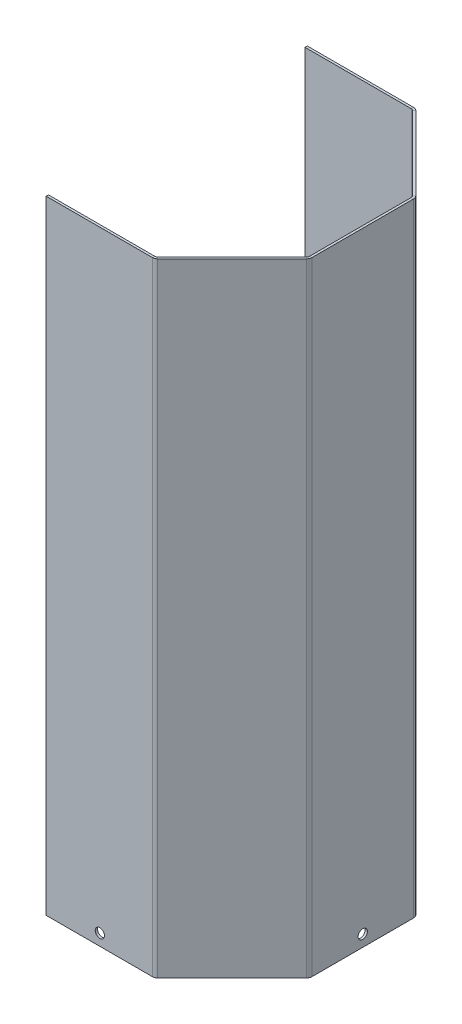
ISO-10303-21;
HEADER;
FILE_DESCRIPTION(('STEP AP214'),'2;1');
FILE_NAME('part.step','',(''),(''),'','','');
FILE_SCHEMA(('AUTOMOTIVE_DESIGN { 1 0 10303 214 1 1 1 1 }'));
ENDSEC;
DATA;
#1=APPLICATION_CONTEXT('core data for automotive mechanical design processes');
#2=APPLICATION_PROTOCOL_DEFINITION('international standard','automotive_design',2000,#1);
#3=PRODUCT_CONTEXT('',#1,'mechanical');
#4=PRODUCT('Part','Part','',(#3));
#5=PRODUCT_RELATED_PRODUCT_CATEGORY('part','',(#4));
#6=PRODUCT_DEFINITION_FORMATION('','',#4);
#7=PRODUCT_DEFINITION_CONTEXT('part definition',#1,'design');
#8=PRODUCT_DEFINITION('design','',#6,#7);
#9=PRODUCT_DEFINITION_SHAPE('','',#8);
#10=(LENGTH_UNIT() NAMED_UNIT(*) SI_UNIT(.MILLI.,.METRE.));
#11=(NAMED_UNIT(*) PLANE_ANGLE_UNIT() SI_UNIT($,.RADIAN.));
#12=(NAMED_UNIT(*) SI_UNIT($,.STERADIAN.) SOLID_ANGLE_UNIT());
#13=UNCERTAINTY_MEASURE_WITH_UNIT(LENGTH_MEASURE(1.E-05),#10,'distance_accuracy_value','');
#14=(GEOMETRIC_REPRESENTATION_CONTEXT(3) GLOBAL_UNCERTAINTY_ASSIGNED_CONTEXT((#13)) GLOBAL_UNIT_ASSIGNED_CONTEXT((#10,
#11,#12)) REPRESENTATION_CONTEXT('',''));
#15=CARTESIAN_POINT('',(0.,0.,0.));
#16=DIRECTION('',(0.,0.,1.));
#17=DIRECTION('',(1.,0.,0.));
#18=AXIS2_PLACEMENT_3D('',#15,#16,#17);
#19=CARTESIAN_POINT('',(43.7119337702441,270.,-55.7556349186104));
#20=DIRECTION('',(0.,1.,0.));
#21=DIRECTION('',(0.,0.,1.));
#22=AXIS2_PLACEMENT_3D('',#19,#20,#21);
#23=PLANE('',#22);
#24=DIRECTION('',(-0.707106781186547,0.,0.707106781186547));
#25=VECTOR('',#24,1.);
#26=CARTESIAN_POINT('',(43.7119337702441,270.,-55.7556349186104));
#27=LINE('',#26,#25);
#28=CARTESIAN_POINT('',(43.7119337702441,270.,-55.7556349186104));
#29=VERTEX_POINT('',#28);
#30=CARTESIAN_POINT('',(43.0048269890576,270.,-55.0485281374238));
#31=VERTEX_POINT('',#30);
#32=EDGE_CURVE('E11',#29,#31,#27,.T.);
#33=ORIENTED_EDGE('',*,*,#32,.F.);
#34=CARTESIAN_POINT('',(42.1562988516337,270.,-54.2));
#35=DIRECTION('',(0.,1.,0.));
#36=DIRECTION('',(0.,0.,1.));
#37=AXIS2_PLACEMENT_3D('',#34,#35,#36);
#38=CIRCLE('',#37,2.2);
#39=CARTESIAN_POINT('',(42.1562988516337,270.,-56.4));
#40=VERTEX_POINT('',#39);
#41=EDGE_CURVE('E388',#40,#29,#38,.F.);
#42=ORIENTED_EDGE('',*,*,#41,.F.);
#43=DIRECTION('',(0.,0.,-1.));
#44=VECTOR('',#43,1.);
#45=CARTESIAN_POINT('',(42.1562988516337,270.,-55.4));
#46=LINE('',#45,#44);
#47=CARTESIAN_POINT('',(42.1562988516337,270.,-55.4));
#48=VERTEX_POINT('',#47);
#49=EDGE_CURVE('E43',#48,#40,#46,.T.);
#50=ORIENTED_EDGE('',*,*,#49,.F.);
#51=CARTESIAN_POINT('',(42.1562988516337,270.,-54.2));
#52=DIRECTION('',(0.,1.,0.));
#53=DIRECTION('',(1.,0.,0.));
#54=AXIS2_PLACEMENT_3D('',#51,#52,#53);
#55=CIRCLE('',#54,1.2);
#56=EDGE_CURVE('E400',#48,#31,#55,.F.);
#57=ORIENTED_EDGE('',*,*,#56,.T.);
#58=EDGE_LOOP('',(#33,#42,#50,#57));
#59=FACE_BOUND('',#58,.T.);
#60=ADVANCED_FACE('F34',(#59),#23,.T.);
#61=CARTESIAN_POINT('',(42.1562988516337,270.,-55.4));
#62=DIRECTION('',(0.,1.,0.));
#63=DIRECTION('',(0.,0.,1.));
#64=AXIS2_PLACEMENT_3D('',#61,#62,#63);
#65=PLANE('',#64);
#66=DIRECTION('',(0.707106781186547,0.,0.707106781186548));
#67=VECTOR('',#66,1.);
#68=CARTESIAN_POINT('',(43.0675686888545,270.,-56.4));
#69=LINE('',#68,#67);
#70=CARTESIAN_POINT('',(75.8343508957581,270.,-23.6332177930964));
#71=VERTEX_POINT('',#70);
#72=EDGE_CURVE('E385',#29,#71,#69,.T.);
#73=ORIENTED_EDGE('',*,*,#72,.F.);
#74=ORIENTED_EDGE('',*,*,#32,.T.);
#75=DIRECTION('',(0.707106781186547,0.,0.707106781186548));
#76=VECTOR('',#75,1.);
#77=CARTESIAN_POINT('',(42.360461907668,270.,-55.6928932188134));
#78=LINE('',#77,#76);
#79=CARTESIAN_POINT('',(75.1272441145716,270.,-22.9261110119098));
#80=VERTEX_POINT('',#79);
#81=EDGE_CURVE('E403',#31,#80,#78,.T.);
#82=ORIENTED_EDGE('',*,*,#81,.T.);
#83=DIRECTION('',(0.707106781186551,0.,-0.707106781186544));
#84=VECTOR('',#83,1.);
#85=CARTESIAN_POINT('',(75.1272441145716,270.,-22.9261110119098));
#86=LINE('',#85,#84);
#87=EDGE_CURVE('E340',#80,#71,#86,.T.);
#88=ORIENTED_EDGE('',*,*,#87,.T.);
#89=EDGE_LOOP('',(#73,#74,#82,#88));
#90=FACE_BOUND('',#89,.T.);
#91=ADVANCED_FACE('F459',(#90),#65,.T.);
#92=CARTESIAN_POINT('',(42.1562988516337,0.,-56.4));
#93=DIRECTION('',(0.,-1.,0.));
#94=DIRECTION('',(0.,0.,-1.));
#95=AXIS2_PLACEMENT_3D('',#92,#93,#94);
#96=PLANE('',#95);
#97=DIRECTION('',(0.,0.,1.));
#98=VECTOR('',#97,1.);
#99=CARTESIAN_POINT('',(42.1562988516337,0.,-56.4));
#100=LINE('',#99,#98);
#101=CARTESIAN_POINT('',(42.1562988516337,0.,-56.4));
#102=VERTEX_POINT('',#101);
#103=CARTESIAN_POINT('',(42.1562988516337,0.,-55.4));
#104=VERTEX_POINT('',#103);
#105=EDGE_CURVE('E346',#102,#104,#100,.T.);
#106=ORIENTED_EDGE('',*,*,#105,.F.);
#107=CARTESIAN_POINT('',(42.1562988516337,0.,-54.2));
#108=DIRECTION('',(0.,1.,0.));
#109=DIRECTION('',(0.,0.,1.));
#110=AXIS2_PLACEMENT_3D('',#107,#108,#109);
#111=CIRCLE('',#110,2.2);
#112=CARTESIAN_POINT('',(43.7119337702441,0.,-55.7556349186104));
#113=VERTEX_POINT('',#112);
#114=EDGE_CURVE('E250',#102,#113,#111,.F.);
#115=ORIENTED_EDGE('',*,*,#114,.T.);
#116=DIRECTION('',(0.707106781186547,0.,-0.707106781186547));
#117=VECTOR('',#116,1.);
#118=CARTESIAN_POINT('',(43.0048269890576,0.,-55.0485281374238));
#119=LINE('',#118,#117);
#120=CARTESIAN_POINT('',(43.0048269890576,0.,-55.0485281374238));
#121=VERTEX_POINT('',#120);
#122=EDGE_CURVE('E344',#121,#113,#119,.T.);
#123=ORIENTED_EDGE('',*,*,#122,.F.);
#124=CARTESIAN_POINT('',(42.1562988516337,0.,-54.2));
#125=DIRECTION('',(0.,1.,0.));
#126=DIRECTION('',(1.,0.,0.));
#127=AXIS2_PLACEMENT_3D('',#124,#125,#126);
#128=CIRCLE('',#127,1.2);
#129=EDGE_CURVE('E262',#104,#121,#128,.F.);
#130=ORIENTED_EDGE('',*,*,#129,.F.);
#131=EDGE_LOOP('',(#106,#115,#123,#130));
#132=FACE_BOUND('',#131,.T.);
#133=ADVANCED_FACE('F464',(#132),#96,.T.);
#134=CARTESIAN_POINT('',(43.0048269890576,0.,-55.0485281374238));
#135=DIRECTION('',(0.,-1.,0.));
#136=DIRECTION('',(0.,0.,-1.));
#137=AXIS2_PLACEMENT_3D('',#134,#135,#136);
#138=PLANE('',#137);
#139=DIRECTION('',(1.,0.,0.));
#140=VECTOR('',#139,1.);
#141=CARTESIAN_POINT('',(-3.93243131114546,0.,-56.4));
#142=LINE('',#141,#140);
#143=CARTESIAN_POINT('',(-3.93243131114546,0.,-56.4));
#144=VERTEX_POINT('',#143);
#145=EDGE_CURVE('E253',#144,#102,#142,.T.);
#146=ORIENTED_EDGE('',*,*,#145,.T.);
#147=ORIENTED_EDGE('',*,*,#105,.T.);
#148=DIRECTION('',(1.,0.,0.));
#149=VECTOR('',#148,1.);
#150=CARTESIAN_POINT('',(-3.93243131114546,0.,-55.4));
#151=LINE('',#150,#149);
#152=CARTESIAN_POINT('',(-3.93243131114546,0.,-55.4));
#153=VERTEX_POINT('',#152);
#154=EDGE_CURVE('E259',#153,#104,#151,.T.);
#155=ORIENTED_EDGE('',*,*,#154,.F.);
#156=DIRECTION('',(0.,0.,-1.));
#157=VECTOR('',#156,1.);
#158=CARTESIAN_POINT('',(-3.93243131114546,0.,-55.4));
#159=LINE('',#158,#157);
#160=EDGE_CURVE('E256',#153,#144,#159,.T.);
#161=ORIENTED_EDGE('',*,*,#160,.T.);
#162=EDGE_LOOP('',(#146,#147,#155,#161));
#163=FACE_BOUND('',#162,.T.);
#164=ADVANCED_FACE('F520',(#163),#138,.T.);
#165=CARTESIAN_POINT('',(76.4787159771477,270.,-22.077582874486));
#166=DIRECTION('',(0.,1.,0.));
#167=DIRECTION('',(0.,0.,1.));
#168=AXIS2_PLACEMENT_3D('',#165,#166,#167);
#169=PLANE('',#168);
#170=DIRECTION('',(-1.,0.,0.));
#171=VECTOR('',#170,1.);
#172=CARTESIAN_POINT('',(76.4787159771477,270.,-22.077582874486));
#173=LINE('',#172,#171);
#174=CARTESIAN_POINT('',(76.4787159771477,270.,-22.077582874486));
#175=VERTEX_POINT('',#174);
#176=CARTESIAN_POINT('',(75.4787159771477,270.,-22.077582874486));
#177=VERTEX_POINT('',#176);
#178=EDGE_CURVE('E342',#175,#177,#173,.T.);
#179=ORIENTED_EDGE('',*,*,#178,.F.);
#180=CARTESIAN_POINT('',(74.2787159771477,270.,-22.077582874486));
#181=DIRECTION('',(0.,1.,0.));
#182=DIRECTION('',(0.,0.,1.));
#183=AXIS2_PLACEMENT_3D('',#180,#181,#182);
#184=CIRCLE('',#183,2.2);
#185=EDGE_CURVE('E382',#71,#175,#184,.F.);
#186=ORIENTED_EDGE('',*,*,#185,.F.);
#187=ORIENTED_EDGE('',*,*,#87,.F.);
#188=CARTESIAN_POINT('',(74.2787159771477,270.,-22.077582874486));
#189=DIRECTION('',(0.,1.,0.));
#190=DIRECTION('',(1.,0.,0.));
#191=AXIS2_PLACEMENT_3D('',#188,#189,#190);
#192=CIRCLE('',#191,1.2);
#193=EDGE_CURVE('E406',#80,#177,#192,.F.);
#194=ORIENTED_EDGE('',*,*,#193,.T.);
#195=EDGE_LOOP('',(#179,#186,#187,#194));
#196=FACE_BOUND('',#195,.T.);
#197=ADVANCED_FACE('F508',(#196),#169,.T.);
#198=CARTESIAN_POINT('',(75.1272441145716,270.,-22.9261110119098));
#199=DIRECTION('',(0.,1.,0.));
#200=DIRECTION('',(0.,0.,1.));
#201=AXIS2_PLACEMENT_3D('',#198,#199,#200);
#202=PLANE('',#201);
#203=DIRECTION('',(0.,0.,1.));
#204=VECTOR('',#203,1.);
#205=CARTESIAN_POINT('',(76.4787159771477,270.,-22.9888527117068));
#206=LINE('',#205,#204);
#207=CARTESIAN_POINT('',(76.4787159771477,270.,22.077582874486));
#208=VERTEX_POINT('',#207);
#209=EDGE_CURVE('E379',#175,#208,#206,.T.);
#210=ORIENTED_EDGE('',*,*,#209,.F.);
#211=ORIENTED_EDGE('',*,*,#178,.T.);
#212=DIRECTION('',(0.,0.,1.));
#213=VECTOR('',#212,1.);
#214=CARTESIAN_POINT('',(75.4787159771477,270.,-22.9888527117068));
#215=LINE('',#214,#213);
#216=CARTESIAN_POINT('',(75.4787159771477,270.,22.077582874486));
#217=VERTEX_POINT('',#216);
#218=EDGE_CURVE('E203',#177,#217,#215,.T.);
#219=ORIENTED_EDGE('',*,*,#218,.T.);
#220=DIRECTION('',(1.,0.,0.));
#221=VECTOR('',#220,1.);
#222=CARTESIAN_POINT('',(75.4787159771477,270.,22.077582874486));
#223=LINE('',#222,#221);
#224=EDGE_CURVE('E194',#217,#208,#223,.T.);
#225=ORIENTED_EDGE('',*,*,#224,.T.);
#226=EDGE_LOOP('',(#210,#211,#219,#225));
#227=FACE_BOUND('',#226,.T.);
#228=ADVANCED_FACE('F412',(#227),#202,.T.);
#229=CARTESIAN_POINT('',(75.8343508957581,0.,-23.6332177930964));
#230=DIRECTION('',(0.,-1.,0.));
#231=DIRECTION('',(0.,0.,-1.));
#232=AXIS2_PLACEMENT_3D('',#229,#230,#231);
#233=PLANE('',#232);
#234=DIRECTION('',(-0.707106781186551,0.,0.707106781186544));
#235=VECTOR('',#234,1.);
#236=CARTESIAN_POINT('',(75.8343508957581,0.,-23.6332177930964));
#237=LINE('',#236,#235);
#238=CARTESIAN_POINT('',(75.8343508957581,0.,-23.6332177930964));
#239=VERTEX_POINT('',#238);
#240=CARTESIAN_POINT('',(75.1272441145716,0.,-22.9261110119098));
#241=VERTEX_POINT('',#240);
#242=EDGE_CURVE('E338',#239,#241,#237,.T.);
#243=ORIENTED_EDGE('',*,*,#242,.F.);
#244=CARTESIAN_POINT('',(74.2787159771477,0.,-22.077582874486));
#245=DIRECTION('',(0.,1.,0.));
#246=DIRECTION('',(0.,0.,1.));
#247=AXIS2_PLACEMENT_3D('',#244,#245,#246);
#248=CIRCLE('',#247,2.2);
#249=CARTESIAN_POINT('',(76.4787159771477,0.,-22.077582874486));
#250=VERTEX_POINT('',#249);
#251=EDGE_CURVE('E244',#239,#250,#248,.F.);
#252=ORIENTED_EDGE('',*,*,#251,.T.);
#253=DIRECTION('',(1.,0.,0.));
#254=VECTOR('',#253,1.);
#255=CARTESIAN_POINT('',(75.4787159771477,0.,-22.077582874486));
#256=LINE('',#255,#254);
#257=CARTESIAN_POINT('',(75.4787159771477,0.,-22.077582874486));
#258=VERTEX_POINT('',#257);
#259=EDGE_CURVE('E193',#258,#250,#256,.T.);
#260=ORIENTED_EDGE('',*,*,#259,.F.);
#261=CARTESIAN_POINT('',(74.2787159771477,0.,-22.077582874486));
#262=DIRECTION('',(0.,1.,0.));
#263=DIRECTION('',(1.,0.,0.));
#264=AXIS2_PLACEMENT_3D('',#261,#262,#263);
#265=CIRCLE('',#264,1.2);
#266=EDGE_CURVE('E268',#241,#258,#265,.F.);
#267=ORIENTED_EDGE('',*,*,#266,.F.);
#268=EDGE_LOOP('',(#243,#252,#260,#267));
#269=FACE_BOUND('',#268,.T.);
#270=ADVANCED_FACE('F532',(#269),#233,.T.);
#271=CARTESIAN_POINT('',(75.4787159771477,0.,-22.077582874486));
#272=DIRECTION('',(0.,-1.,0.));
#273=DIRECTION('',(0.,0.,-1.));
#274=AXIS2_PLACEMENT_3D('',#271,#272,#273);
#275=PLANE('',#274);
#276=DIRECTION('',(0.707106781186547,0.,0.707106781186548));
#277=VECTOR('',#276,1.);
#278=CARTESIAN_POINT('',(43.0675686888545,0.,-56.4));
#279=LINE('',#278,#277);
#280=EDGE_CURVE('E247',#113,#239,#279,.T.);
#281=ORIENTED_EDGE('',*,*,#280,.T.);
#282=ORIENTED_EDGE('',*,*,#242,.T.);
#283=DIRECTION('',(0.707106781186547,0.,0.707106781186548));
#284=VECTOR('',#283,1.);
#285=CARTESIAN_POINT('',(42.360461907668,0.,-55.6928932188134));
#286=LINE('',#285,#284);
#287=EDGE_CURVE('E265',#121,#241,#286,.T.);
#288=ORIENTED_EDGE('',*,*,#287,.F.);
#289=ORIENTED_EDGE('',*,*,#122,.T.);
#290=EDGE_LOOP('',(#281,#282,#288,#289));
#291=FACE_BOUND('',#290,.T.);
#292=ADVANCED_FACE('F517',(#291),#275,.T.);
#293=CARTESIAN_POINT('',(75.8343508957581,270.,23.6332177930964));
#294=DIRECTION('',(0.,1.,0.));
#295=DIRECTION('',(0.,0.,1.));
#296=AXIS2_PLACEMENT_3D('',#293,#294,#295);
#297=PLANE('',#296);
#298=DIRECTION('',(-0.707106781186546,0.,-0.707106781186549));
#299=VECTOR('',#298,1.);
#300=CARTESIAN_POINT('',(75.8343508957581,270.,23.6332177930964));
#301=LINE('',#300,#299);
#302=CARTESIAN_POINT('',(75.8343508957581,270.,23.6332177930964));
#303=VERTEX_POINT('',#302);
#304=CARTESIAN_POINT('',(75.1272441145716,270.,22.9261110119098));
#305=VERTEX_POINT('',#304);
#306=EDGE_CURVE('E181',#303,#305,#301,.T.);
#307=ORIENTED_EDGE('',*,*,#306,.F.);
#308=CARTESIAN_POINT('',(74.2787159771477,270.,22.077582874486));
#309=DIRECTION('',(0.,1.,0.));
#310=DIRECTION('',(0.,0.,1.));
#311=AXIS2_PLACEMENT_3D('',#308,#309,#310);
#312=CIRCLE('',#311,2.2);
#313=EDGE_CURVE('E377',#208,#303,#312,.F.);
#314=ORIENTED_EDGE('',*,*,#313,.F.);
#315=ORIENTED_EDGE('',*,*,#224,.F.);
#316=CARTESIAN_POINT('',(74.2787159771477,270.,22.077582874486));
#317=DIRECTION('',(0.,1.,0.));
#318=DIRECTION('',(1.,0.,0.));
#319=AXIS2_PLACEMENT_3D('',#316,#317,#318);
#320=CIRCLE('',#319,1.2);
#321=EDGE_CURVE('E197',#217,#305,#320,.F.);
#322=ORIENTED_EDGE('',*,*,#321,.T.);
#323=EDGE_LOOP('',(#307,#314,#315,#322));
#324=FACE_BOUND('',#323,.T.);
#325=ADVANCED_FACE('F199',(#324),#297,.T.);
#326=CARTESIAN_POINT('',(75.4787159771477,270.,22.077582874486));
#327=DIRECTION('',(0.,1.,0.));
#328=DIRECTION('',(0.,0.,1.));
#329=AXIS2_PLACEMENT_3D('',#326,#327,#328);
#330=PLANE('',#329);
#331=DIRECTION('',(-0.707106781186548,0.,0.707106781186548));
#332=VECTOR('',#331,1.);
#333=CARTESIAN_POINT('',(76.4787159771477,270.,22.9888527117068));
#334=LINE('',#333,#332);
#335=CARTESIAN_POINT('',(43.5119337702441,270.,55.9556349186104));
#336=VERTEX_POINT('',#335);
#337=EDGE_CURVE('E188',#303,#336,#334,.T.);
#338=ORIENTED_EDGE('',*,*,#337,.F.);
#339=ORIENTED_EDGE('',*,*,#306,.T.);
#340=DIRECTION('',(-0.707106781186548,0.,0.707106781186548));
#341=VECTOR('',#340,1.);
#342=CARTESIAN_POINT('',(75.7716091959612,270.,22.2817459305202));
#343=LINE('',#342,#341);
#344=CARTESIAN_POINT('',(42.8048269890575,270.,55.2485281374239));
#345=VERTEX_POINT('',#344);
#346=EDGE_CURVE('E185',#305,#345,#343,.T.);
#347=ORIENTED_EDGE('',*,*,#346,.T.);
#348=DIRECTION('',(0.707106781186544,0.,0.707106781186551));
#349=VECTOR('',#348,1.);
#350=CARTESIAN_POINT('',(42.8048269890575,270.,55.2485281374239));
#351=LINE('',#350,#349);
#352=EDGE_CURVE('E329',#345,#336,#351,.T.);
#353=ORIENTED_EDGE('',*,*,#352,.T.);
#354=EDGE_LOOP('',(#338,#339,#347,#353));
#355=FACE_BOUND('',#354,.T.);
#356=ADVANCED_FACE('F183',(#355),#330,.T.);
#357=CARTESIAN_POINT('',(76.4787159771477,0.,22.077582874486));
#358=DIRECTION('',(0.,-1.,0.));
#359=DIRECTION('',(0.,0.,-1.));
#360=AXIS2_PLACEMENT_3D('',#357,#358,#359);
#361=PLANE('',#360);
#362=DIRECTION('',(-1.,0.,0.));
#363=VECTOR('',#362,1.);
#364=CARTESIAN_POINT('',(76.4787159771477,0.,22.077582874486));
#365=LINE('',#364,#363);
#366=CARTESIAN_POINT('',(76.4787159771477,0.,22.077582874486));
#367=VERTEX_POINT('',#366);
#368=CARTESIAN_POINT('',(75.4787159771477,0.,22.077582874486));
#369=VERTEX_POINT('',#368);
#370=EDGE_CURVE('E334',#367,#369,#365,.T.);
#371=ORIENTED_EDGE('',*,*,#370,.F.);
#372=CARTESIAN_POINT('',(74.2787159771477,0.,22.077582874486));
#373=DIRECTION('',(0.,1.,0.));
#374=DIRECTION('',(0.,0.,1.));
#375=AXIS2_PLACEMENT_3D('',#372,#373,#374);
#376=CIRCLE('',#375,2.2);
#377=CARTESIAN_POINT('',(75.8343508957581,0.,23.6332177930964));
#378=VERTEX_POINT('',#377);
#379=EDGE_CURVE('E238',#367,#378,#376,.F.);
#380=ORIENTED_EDGE('',*,*,#379,.T.);
#381=DIRECTION('',(0.707106781186546,0.,0.707106781186549));
#382=VECTOR('',#381,1.);
#383=CARTESIAN_POINT('',(75.1272441145716,0.,22.9261110119098));
#384=LINE('',#383,#382);
#385=CARTESIAN_POINT('',(75.1272441145716,0.,22.9261110119098));
#386=VERTEX_POINT('',#385);
#387=EDGE_CURVE('E332',#386,#378,#384,.T.);
#388=ORIENTED_EDGE('',*,*,#387,.F.);
#389=CARTESIAN_POINT('',(74.2787159771477,0.,22.077582874486));
#390=DIRECTION('',(0.,1.,0.));
#391=DIRECTION('',(1.,0.,0.));
#392=AXIS2_PLACEMENT_3D('',#389,#390,#391);
#393=CIRCLE('',#392,1.2);
#394=EDGE_CURVE('E210',#369,#386,#393,.F.);
#395=ORIENTED_EDGE('',*,*,#394,.F.);
#396=EDGE_LOOP('',(#371,#380,#388,#395));
#397=FACE_BOUND('',#396,.T.);
#398=ADVANCED_FACE('F418',(#397),#361,.T.);
#399=CARTESIAN_POINT('',(75.1272441145716,0.,22.9261110119098));
#400=DIRECTION('',(0.,-1.,0.));
#401=DIRECTION('',(0.,0.,-1.));
#402=AXIS2_PLACEMENT_3D('',#399,#400,#401);
#403=PLANE('',#402);
#404=DIRECTION('',(0.,0.,1.));
#405=VECTOR('',#404,1.);
#406=CARTESIAN_POINT('',(76.4787159771477,0.,-22.9888527117068));
#407=LINE('',#406,#405);
#408=EDGE_CURVE('E241',#250,#367,#407,.T.);
#409=ORIENTED_EDGE('',*,*,#408,.T.);
#410=ORIENTED_EDGE('',*,*,#370,.T.);
#411=DIRECTION('',(0.,0.,1.));
#412=VECTOR('',#411,1.);
#413=CARTESIAN_POINT('',(75.4787159771477,0.,-22.9888527117068));
#414=LINE('',#413,#412);
#415=EDGE_CURVE('E271',#258,#369,#414,.T.);
#416=ORIENTED_EDGE('',*,*,#415,.F.);
#417=ORIENTED_EDGE('',*,*,#259,.T.);
#418=EDGE_LOOP('',(#409,#410,#416,#417));
#419=FACE_BOUND('',#418,.T.);
#420=ADVANCED_FACE('F543',(#419),#403,.T.);
#421=CARTESIAN_POINT('',(41.9562988516337,270.,56.6));
#422=DIRECTION('',(0.,1.,0.));
#423=DIRECTION('',(0.,0.,1.));
#424=AXIS2_PLACEMENT_3D('',#421,#422,#423);
#425=PLANE('',#424);
#426=DIRECTION('',(0.,0.,-1.));
#427=VECTOR('',#426,1.);
#428=CARTESIAN_POINT('',(41.9562988516337,270.,56.6));
#429=LINE('',#428,#427);
#430=CARTESIAN_POINT('',(41.9562988516337,270.,56.6));
#431=VERTEX_POINT('',#430);
#432=CARTESIAN_POINT('',(41.9562988516337,270.,55.6));
#433=VERTEX_POINT('',#432);
#434=EDGE_CURVE('E52',#431,#433,#429,.T.);
#435=ORIENTED_EDGE('',*,*,#434,.F.);
#436=CARTESIAN_POINT('',(41.9562988516337,270.,54.4));
#437=DIRECTION('',(0.,1.,0.));
#438=DIRECTION('',(0.,0.,1.));
#439=AXIS2_PLACEMENT_3D('',#436,#437,#438);
#440=CIRCLE('',#439,2.2);
#441=EDGE_CURVE('E373',#336,#431,#440,.F.);
#442=ORIENTED_EDGE('',*,*,#441,.F.);
#443=ORIENTED_EDGE('',*,*,#352,.F.);
#444=CARTESIAN_POINT('',(41.9562988516337,270.,54.4));
#445=DIRECTION('',(0.,1.,0.));
#446=DIRECTION('',(1.,0.,0.));
#447=AXIS2_PLACEMENT_3D('',#444,#445,#446);
#448=CIRCLE('',#447,1.2);
#449=EDGE_CURVE('E218',#345,#433,#448,.F.);
#450=ORIENTED_EDGE('',*,*,#449,.T.);
#451=EDGE_LOOP('',(#435,#442,#443,#450));
#452=FACE_BOUND('',#451,.T.);
#453=ADVANCED_FACE('F546',(#452),#425,.T.);
#454=CARTESIAN_POINT('',(42.8048269890575,270.,55.2485281374239));
#455=DIRECTION('',(0.,1.,0.));
#456=DIRECTION('',(0.,0.,1.));
#457=AXIS2_PLACEMENT_3D('',#454,#455,#456);
#458=PLANE('',#457);
#459=DIRECTION('',(-1.,0.,0.));
#460=VECTOR('',#459,1.);
#461=CARTESIAN_POINT('',(42.8675686888545,270.,56.6));
#462=LINE('',#461,#460);
#463=CARTESIAN_POINT('',(-4.1324313111455,270.,56.6));
#464=VERTEX_POINT('',#463);
#465=EDGE_CURVE('E370',#431,#464,#462,.T.);
#466=ORIENTED_EDGE('',*,*,#465,.F.);
#467=ORIENTED_EDGE('',*,*,#434,.T.);
#468=DIRECTION('',(1.,0.,0.));
#469=VECTOR('',#468,1.);
#470=CARTESIAN_POINT('',(42.8675686888545,270.,55.6));
#471=LINE('',#470,#469);
#472=CARTESIAN_POINT('',(-4.1324313111455,270.,55.6));
#473=VERTEX_POINT('',#472);
#474=EDGE_CURVE('E130',#433,#473,#471,.F.);
#475=ORIENTED_EDGE('',*,*,#474,.T.);
#476=DIRECTION('',(0.,0.,-1.));
#477=VECTOR('',#476,1.);
#478=CARTESIAN_POINT('',(-4.1324313111455,270.,56.6));
#479=LINE('',#478,#477);
#480=EDGE_CURVE('E367',#464,#473,#479,.T.);
#481=ORIENTED_EDGE('',*,*,#480,.F.);
#482=EDGE_LOOP('',(#466,#467,#475,#481));
#483=FACE_BOUND('',#482,.T.);
#484=ADVANCED_FACE('F445',(#483),#458,.T.);
#485=CARTESIAN_POINT('',(43.5119337702441,0.,55.9556349186104));
#486=DIRECTION('',(0.,-1.,0.));
#487=DIRECTION('',(0.,0.,-1.));
#488=AXIS2_PLACEMENT_3D('',#485,#486,#487);
#489=PLANE('',#488);
#490=DIRECTION('',(-0.707106781186544,0.,-0.707106781186551));
#491=VECTOR('',#490,1.);
#492=CARTESIAN_POINT('',(43.5119337702441,0.,55.9556349186104));
#493=LINE('',#492,#491);
#494=CARTESIAN_POINT('',(43.5119337702441,0.,55.9556349186104));
#495=VERTEX_POINT('',#494);
#496=CARTESIAN_POINT('',(42.8048269890575,0.,55.2485281374239));
#497=VERTEX_POINT('',#496);
#498=EDGE_CURVE('E117',#495,#497,#493,.T.);
#499=ORIENTED_EDGE('',*,*,#498,.F.);
#500=CARTESIAN_POINT('',(41.9562988516337,0.,54.4));
#501=DIRECTION('',(0.,1.,0.));
#502=DIRECTION('',(0.,0.,1.));
#503=AXIS2_PLACEMENT_3D('',#500,#501,#502);
#504=CIRCLE('',#503,2.2);
#505=CARTESIAN_POINT('',(41.9562988516337,0.,56.6));
#506=VERTEX_POINT('',#505);
#507=EDGE_CURVE('E234',#495,#506,#504,.F.);
#508=ORIENTED_EDGE('',*,*,#507,.T.);
#509=DIRECTION('',(0.,0.,1.));
#510=VECTOR('',#509,1.);
#511=CARTESIAN_POINT('',(41.9562988516337,0.,55.6));
#512=LINE('',#511,#510);
#513=CARTESIAN_POINT('',(41.9562988516337,0.,55.6));
#514=VERTEX_POINT('',#513);
#515=EDGE_CURVE('E124',#514,#506,#512,.T.);
#516=ORIENTED_EDGE('',*,*,#515,.F.);
#517=CARTESIAN_POINT('',(41.9562988516337,0.,54.4));
#518=DIRECTION('',(0.,1.,0.));
#519=DIRECTION('',(1.,0.,0.));
#520=AXIS2_PLACEMENT_3D('',#517,#518,#519);
#521=CIRCLE('',#520,1.2);
#522=EDGE_CURVE('E277',#497,#514,#521,.F.);
#523=ORIENTED_EDGE('',*,*,#522,.F.);
#524=EDGE_LOOP('',(#499,#508,#516,#523));
#525=FACE_BOUND('',#524,.T.);
#526=ADVANCED_FACE('F433',(#525),#489,.T.);
#527=CARTESIAN_POINT('',(41.9562988516337,0.,55.6));
#528=DIRECTION('',(0.,-1.,0.));
#529=DIRECTION('',(0.,0.,-1.));
#530=AXIS2_PLACEMENT_3D('',#527,#528,#529);
#531=PLANE('',#530);
#532=DIRECTION('',(-0.707106781186548,0.,0.707106781186548));
#533=VECTOR('',#532,1.);
#534=CARTESIAN_POINT('',(76.4787159771477,0.,22.9888527117068));
#535=LINE('',#534,#533);
#536=EDGE_CURVE('E236',#378,#495,#535,.T.);
#537=ORIENTED_EDGE('',*,*,#536,.T.);
#538=ORIENTED_EDGE('',*,*,#498,.T.);
#539=DIRECTION('',(-0.707106781186548,0.,0.707106781186548));
#540=VECTOR('',#539,1.);
#541=CARTESIAN_POINT('',(75.7716091959612,0.,22.2817459305202));
#542=LINE('',#541,#540);
#543=EDGE_CURVE('E275',#386,#497,#542,.T.);
#544=ORIENTED_EDGE('',*,*,#543,.F.);
#545=ORIENTED_EDGE('',*,*,#387,.T.);
#546=EDGE_LOOP('',(#537,#538,#544,#545));
#547=FACE_BOUND('',#546,.T.);
#548=ADVANCED_FACE('F420',(#547),#531,.T.);
#549=CARTESIAN_POINT('',(42.8675686888545,270.,55.6));
#550=DIRECTION('',(0.,0.,1.));
#551=DIRECTION('',(1.,0.,0.));
#552=AXIS2_PLACEMENT_3D('',#549,#550,#551);
#553=PLANE('',#552);
#554=CARTESIAN_POINT('',(19.1119337702441,5.,55.6));
#555=DIRECTION('',(0.,0.,1.));
#556=DIRECTION('',(1.,0.,0.));
#557=AXIS2_PLACEMENT_3D('',#554,#555,#556);
#558=CIRCLE('',#557,2.);
#559=CARTESIAN_POINT('',(21.1119337702441,5.,55.6));
#560=VERTEX_POINT('',#559);
#561=EDGE_CURVE('E228',#560,#560,#558,.T.);
#562=ORIENTED_EDGE('',*,*,#561,.T.);
#563=EDGE_LOOP('',(#562));
#564=FACE_BOUND('',#563,.T.);
#565=DIRECTION('',(1.,0.,0.));
#566=VECTOR('',#565,1.);
#567=CARTESIAN_POINT('',(42.8675686888545,0.,55.6));
#568=LINE('',#567,#566);
#569=CARTESIAN_POINT('',(-4.1324313111455,0.,55.6));
#570=VERTEX_POINT('',#569);
#571=EDGE_CURVE('E224',#514,#570,#568,.F.);
#572=ORIENTED_EDGE('',*,*,#571,.T.);
#573=DIRECTION('',(0.,-1.,0.));
#574=VECTOR('',#573,1.);
#575=CARTESIAN_POINT('',(-4.1324313111455,270.,55.6));
#576=LINE('',#575,#574);
#577=EDGE_CURVE('E325',#473,#570,#576,.T.);
#578=ORIENTED_EDGE('',*,*,#577,.F.);
#579=ORIENTED_EDGE('',*,*,#474,.F.);
#580=DIRECTION('',(0.,-1.,0.));
#581=VECTOR('',#580,1.);
#582=CARTESIAN_POINT('',(41.9562988516337,270.,55.6));
#583=LINE('',#582,#581);
#584=EDGE_CURVE('E220',#433,#514,#583,.T.);
#585=ORIENTED_EDGE('',*,*,#584,.T.);
#586=EDGE_LOOP('',(#572,#578,#579,#585));
#587=FACE_BOUND('',#586,.T.);
#588=ADVANCED_FACE('F439',(#564,#587),#553,.F.);
#589=CARTESIAN_POINT('',(-4.1324313111455,270.,56.6));
#590=DIRECTION('',(-1.,0.,0.));
#591=DIRECTION('',(0.,0.,1.));
#592=AXIS2_PLACEMENT_3D('',#589,#590,#591);
#593=PLANE('',#592);
#594=DIRECTION('',(0.,0.,-1.));
#595=VECTOR('',#594,1.);
#596=CARTESIAN_POINT('',(-4.1324313111455,0.,56.6));
#597=LINE('',#596,#595);
#598=CARTESIAN_POINT('',(-4.1324313111455,0.,56.6));
#599=VERTEX_POINT('',#598);
#600=EDGE_CURVE('E227',#599,#570,#597,.T.);
#601=ORIENTED_EDGE('',*,*,#600,.F.);
#602=DIRECTION('',(0.,-1.,0.));
#603=VECTOR('',#602,1.);
#604=CARTESIAN_POINT('',(-4.1324313111455,270.,56.6));
#605=LINE('',#604,#603);
#606=EDGE_CURVE('E323',#464,#599,#605,.T.);
#607=ORIENTED_EDGE('',*,*,#606,.F.);
#608=ORIENTED_EDGE('',*,*,#480,.T.);
#609=ORIENTED_EDGE('',*,*,#577,.T.);
#610=EDGE_LOOP('',(#601,#607,#608,#609));
#611=FACE_BOUND('',#610,.T.);
#612=ADVANCED_FACE('F444',(#611),#593,.T.);
#613=CARTESIAN_POINT('',(42.8675686888545,270.,56.6));
#614=DIRECTION('',(0.,0.,1.));
#615=DIRECTION('',(1.,0.,0.));
#616=AXIS2_PLACEMENT_3D('',#613,#614,#615);
#617=PLANE('',#616);
#618=CARTESIAN_POINT('',(19.1119337702441,5.,56.6));
#619=DIRECTION('',(0.,0.,1.));
#620=DIRECTION('',(1.,0.,0.));
#621=AXIS2_PLACEMENT_3D('',#618,#619,#620);
#622=CIRCLE('',#621,2.);
#623=CARTESIAN_POINT('',(21.1119337702441,5.,56.6));
#624=VERTEX_POINT('',#623);
#625=EDGE_CURVE('E350',#624,#624,#622,.T.);
#626=ORIENTED_EDGE('',*,*,#625,.F.);
#627=EDGE_LOOP('',(#626));
#628=FACE_BOUND('',#627,.T.);
#629=DIRECTION('',(-1.,0.,0.));
#630=VECTOR('',#629,1.);
#631=CARTESIAN_POINT('',(42.8675686888545,0.,56.6));
#632=LINE('',#631,#630);
#633=EDGE_CURVE('E231',#506,#599,#632,.T.);
#634=ORIENTED_EDGE('',*,*,#633,.F.);
#635=DIRECTION('',(0.,-1.,0.));
#636=VECTOR('',#635,1.);
#637=CARTESIAN_POINT('',(41.9562988516337,270.,56.6));
#638=LINE('',#637,#636);
#639=EDGE_CURVE('E320',#431,#506,#638,.T.);
#640=ORIENTED_EDGE('',*,*,#639,.F.);
#641=ORIENTED_EDGE('',*,*,#465,.T.);
#642=ORIENTED_EDGE('',*,*,#606,.T.);
#643=EDGE_LOOP('',(#634,#640,#641,#642));
#644=FACE_BOUND('',#643,.T.);
#645=ADVANCED_FACE('F447',(#628,#644),#617,.T.);
#646=CARTESIAN_POINT('',(41.9562988516337,270.,54.4));
#647=DIRECTION('',(0.,-1.,0.));
#648=DIRECTION('',(0.,0.,-1.));
#649=AXIS2_PLACEMENT_3D('',#646,#647,#648);
#650=CYLINDRICAL_SURFACE('',#649,2.2);
#651=ORIENTED_EDGE('',*,*,#507,.F.);
#652=DIRECTION('',(0.,-1.,0.));
#653=VECTOR('',#652,1.);
#654=CARTESIAN_POINT('',(43.5119337702441,270.,55.9556349186104));
#655=LINE('',#654,#653);
#656=EDGE_CURVE('E317',#336,#495,#655,.T.);
#657=ORIENTED_EDGE('',*,*,#656,.F.);
#658=ORIENTED_EDGE('',*,*,#441,.T.);
#659=ORIENTED_EDGE('',*,*,#639,.T.);
#660=EDGE_LOOP('',(#651,#657,#658,#659));
#661=FACE_BOUND('',#660,.T.);
#662=ADVANCED_FACE('F430',(#661),#650,.T.);
#663=CARTESIAN_POINT('',(76.4787159771477,270.,22.9888527117068));
#664=DIRECTION('',(0.707106781186547,0.,0.707106781186547));
#665=DIRECTION('',(0.707106781186548,0.,-0.707106781186548));
#666=AXIS2_PLACEMENT_3D('',#663,#664,#665);
#667=PLANE('',#666);
#668=ORIENTED_EDGE('',*,*,#536,.F.);
#669=DIRECTION('',(0.,-1.,0.));
#670=VECTOR('',#669,1.);
#671=CARTESIAN_POINT('',(75.8343508957581,270.,23.6332177930964));
#672=LINE('',#671,#670);
#673=EDGE_CURVE('E314',#303,#378,#672,.T.);
#674=ORIENTED_EDGE('',*,*,#673,.F.);
#675=ORIENTED_EDGE('',*,*,#337,.T.);
#676=ORIENTED_EDGE('',*,*,#656,.T.);
#677=EDGE_LOOP('',(#668,#674,#675,#676));
#678=FACE_BOUND('',#677,.T.);
#679=ADVANCED_FACE('F425',(#678),#667,.T.);
#680=CARTESIAN_POINT('',(74.2787159771477,270.,22.077582874486));
#681=DIRECTION('',(0.,-1.,0.));
#682=DIRECTION('',(0.,0.,-1.));
#683=AXIS2_PLACEMENT_3D('',#680,#681,#682);
#684=CYLINDRICAL_SURFACE('',#683,2.2);
#685=ORIENTED_EDGE('',*,*,#379,.F.);
#686=DIRECTION('',(0.,-1.,0.));
#687=VECTOR('',#686,1.);
#688=CARTESIAN_POINT('',(76.4787159771477,270.,22.077582874486));
#689=LINE('',#688,#687);
#690=EDGE_CURVE('E311',#208,#367,#689,.T.);
#691=ORIENTED_EDGE('',*,*,#690,.F.);
#692=ORIENTED_EDGE('',*,*,#313,.T.);
#693=ORIENTED_EDGE('',*,*,#673,.T.);
#694=EDGE_LOOP('',(#685,#691,#692,#693));
#695=FACE_BOUND('',#694,.T.);
#696=ADVANCED_FACE('F423',(#695),#684,.T.);
#697=CARTESIAN_POINT('',(76.4787159771477,270.,-22.9888527117068));
#698=DIRECTION('',(1.,0.,0.));
#699=DIRECTION('',(0.,0.,-1.));
#700=AXIS2_PLACEMENT_3D('',#697,#698,#699);
#701=PLANE('',#700);
#702=CARTESIAN_POINT('',(76.4787159771477,5.,0.));
#703=DIRECTION('',(1.,0.,0.));
#704=DIRECTION('',(0.,0.,-1.));
#705=AXIS2_PLACEMENT_3D('',#702,#703,#704);
#706=CIRCLE('',#705,2.);
#707=CARTESIAN_POINT('',(76.4787159771477,5.,-2.00000000000002));
#708=VERTEX_POINT('',#707);
#709=EDGE_CURVE('E361',#708,#708,#706,.T.);
#710=ORIENTED_EDGE('',*,*,#709,.F.);
#711=EDGE_LOOP('',(#710));
#712=FACE_BOUND('',#711,.T.);
#713=ORIENTED_EDGE('',*,*,#408,.F.);
#714=DIRECTION('',(0.,-1.,0.));
#715=VECTOR('',#714,1.);
#716=CARTESIAN_POINT('',(76.4787159771477,270.,-22.077582874486));
#717=LINE('',#716,#715);
#718=EDGE_CURVE('E308',#175,#250,#717,.T.);
#719=ORIENTED_EDGE('',*,*,#718,.F.);
#720=ORIENTED_EDGE('',*,*,#209,.T.);
#721=ORIENTED_EDGE('',*,*,#690,.T.);
#722=EDGE_LOOP('',(#713,#719,#720,#721));
#723=FACE_BOUND('',#722,.T.);
#724=ADVANCED_FACE('F608',(#712,#723),#701,.T.);
#725=CARTESIAN_POINT('',(74.2787159771477,270.,-22.077582874486));
#726=DIRECTION('',(0.,-1.,0.));
#727=DIRECTION('',(0.,0.,-1.));
#728=AXIS2_PLACEMENT_3D('',#725,#726,#727);
#729=CYLINDRICAL_SURFACE('',#728,2.2);
#730=ORIENTED_EDGE('',*,*,#251,.F.);
#731=DIRECTION('',(0.,-1.,0.));
#732=VECTOR('',#731,1.);
#733=CARTESIAN_POINT('',(75.8343508957581,270.,-23.6332177930964));
#734=LINE('',#733,#732);
#735=EDGE_CURVE('E305',#71,#239,#734,.T.);
#736=ORIENTED_EDGE('',*,*,#735,.F.);
#737=ORIENTED_EDGE('',*,*,#185,.T.);
#738=ORIENTED_EDGE('',*,*,#718,.T.);
#739=EDGE_LOOP('',(#730,#736,#737,#738));
#740=FACE_BOUND('',#739,.T.);
#741=ADVANCED_FACE('F513',(#740),#729,.T.);
#742=CARTESIAN_POINT('',(43.0675686888545,270.,-56.4));
#743=DIRECTION('',(0.707106781186548,0.,-0.707106781186547));
#744=DIRECTION('',(-0.707106781186547,0.,-0.707106781186548));
#745=AXIS2_PLACEMENT_3D('',#742,#743,#744);
#746=PLANE('',#745);
#747=ORIENTED_EDGE('',*,*,#280,.F.);
#748=DIRECTION('',(0.,-1.,0.));
#749=VECTOR('',#748,1.);
#750=CARTESIAN_POINT('',(43.7119337702441,270.,-55.7556349186104));
#751=LINE('',#750,#749);
#752=EDGE_CURVE('E302',#29,#113,#751,.T.);
#753=ORIENTED_EDGE('',*,*,#752,.F.);
#754=ORIENTED_EDGE('',*,*,#72,.T.);
#755=ORIENTED_EDGE('',*,*,#735,.T.);
#756=EDGE_LOOP('',(#747,#753,#754,#755));
#757=FACE_BOUND('',#756,.T.);
#758=ADVANCED_FACE('F473',(#757),#746,.T.);
#759=CARTESIAN_POINT('',(42.1562988516337,270.,-54.2));
#760=DIRECTION('',(0.,-1.,0.));
#761=DIRECTION('',(0.,0.,-1.));
#762=AXIS2_PLACEMENT_3D('',#759,#760,#761);
#763=CYLINDRICAL_SURFACE('',#762,2.2);
#764=ORIENTED_EDGE('',*,*,#114,.F.);
#765=DIRECTION('',(0.,-1.,0.));
#766=VECTOR('',#765,1.);
#767=CARTESIAN_POINT('',(42.1562988516337,270.,-56.4));
#768=LINE('',#767,#766);
#769=EDGE_CURVE('E299',#40,#102,#768,.T.);
#770=ORIENTED_EDGE('',*,*,#769,.F.);
#771=ORIENTED_EDGE('',*,*,#41,.T.);
#772=ORIENTED_EDGE('',*,*,#752,.T.);
#773=EDGE_LOOP('',(#764,#770,#771,#772));
#774=FACE_BOUND('',#773,.T.);
#775=ADVANCED_FACE('F478',(#774),#763,.T.);
#776=CARTESIAN_POINT('',(-3.93243131114546,270.,-56.4));
#777=DIRECTION('',(0.,0.,-1.));
#778=DIRECTION('',(-1.,0.,0.));
#779=AXIS2_PLACEMENT_3D('',#776,#777,#778);
#780=PLANE('',#779);
#781=CARTESIAN_POINT('',(19.1119337702441,5.,-56.4));
#782=DIRECTION('',(0.,0.,-1.));
#783=DIRECTION('',(-1.,0.,0.));
#784=AXIS2_PLACEMENT_3D('',#781,#782,#783);
#785=CIRCLE('',#784,2.);
#786=CARTESIAN_POINT('',(17.1119337702441,5.,-56.4));
#787=VERTEX_POINT('',#786);
#788=EDGE_CURVE('E351',#787,#787,#785,.T.);
#789=ORIENTED_EDGE('',*,*,#788,.F.);
#790=EDGE_LOOP('',(#789));
#791=FACE_BOUND('',#790,.T.);
#792=ORIENTED_EDGE('',*,*,#145,.F.);
#793=DIRECTION('',(0.,-1.,0.));
#794=VECTOR('',#793,1.);
#795=CARTESIAN_POINT('',(-3.93243131114546,270.,-56.4));
#796=LINE('',#795,#794);
#797=CARTESIAN_POINT('',(-3.93243131114546,270.,-56.4));
#798=VERTEX_POINT('',#797);
#799=EDGE_CURVE('E297',#798,#144,#796,.T.);
#800=ORIENTED_EDGE('',*,*,#799,.F.);
#801=DIRECTION('',(1.,0.,0.));
#802=VECTOR('',#801,1.);
#803=CARTESIAN_POINT('',(-3.93243131114546,270.,-56.4));
#804=LINE('',#803,#802);
#805=EDGE_CURVE('E391',#798,#40,#804,.T.);
#806=ORIENTED_EDGE('',*,*,#805,.T.);
#807=ORIENTED_EDGE('',*,*,#769,.T.);
#808=EDGE_LOOP('',(#792,#800,#806,#807));
#809=FACE_BOUND('',#808,.T.);
#810=ADVANCED_FACE('F481',(#791,#809),#780,.T.);
#811=CARTESIAN_POINT('',(-3.93243131114546,270.,-55.4));
#812=DIRECTION('',(-1.,0.,0.));
#813=DIRECTION('',(0.,0.,1.));
#814=AXIS2_PLACEMENT_3D('',#811,#812,#813);
#815=PLANE('',#814);
#816=ORIENTED_EDGE('',*,*,#160,.F.);
#817=DIRECTION('',(0.,-1.,0.));
#818=VECTOR('',#817,1.);
#819=CARTESIAN_POINT('',(-3.93243131114546,270.,-55.4));
#820=LINE('',#819,#818);
#821=CARTESIAN_POINT('',(-3.93243131114546,270.,-55.4));
#822=VERTEX_POINT('',#821);
#823=EDGE_CURVE('E295',#822,#153,#820,.T.);
#824=ORIENTED_EDGE('',*,*,#823,.F.);
#825=DIRECTION('',(0.,0.,-1.));
#826=VECTOR('',#825,1.);
#827=CARTESIAN_POINT('',(-3.93243131114546,270.,-55.4));
#828=LINE('',#827,#826);
#829=EDGE_CURVE('E394',#822,#798,#828,.T.);
#830=ORIENTED_EDGE('',*,*,#829,.T.);
#831=ORIENTED_EDGE('',*,*,#799,.T.);
#832=EDGE_LOOP('',(#816,#824,#830,#831));
#833=FACE_BOUND('',#832,.T.);
#834=ADVANCED_FACE('F488',(#833),#815,.T.);
#835=CARTESIAN_POINT('',(-3.93243131114546,270.,-55.4));
#836=DIRECTION('',(0.,0.,-1.));
#837=DIRECTION('',(-1.,0.,0.));
#838=AXIS2_PLACEMENT_3D('',#835,#836,#837);
#839=PLANE('',#838);
#840=CARTESIAN_POINT('',(19.1119337702441,5.,-55.4));
#841=DIRECTION('',(0.,0.,-1.));
#842=DIRECTION('',(-1.,0.,0.));
#843=AXIS2_PLACEMENT_3D('',#840,#841,#842);
#844=CIRCLE('',#843,2.);
#845=CARTESIAN_POINT('',(17.1119337702441,5.,-55.4));
#846=VERTEX_POINT('',#845);
#847=EDGE_CURVE('E348',#846,#846,#844,.T.);
#848=ORIENTED_EDGE('',*,*,#847,.T.);
#849=EDGE_LOOP('',(#848));
#850=FACE_BOUND('',#849,.T.);
#851=ORIENTED_EDGE('',*,*,#154,.T.);
#852=DIRECTION('',(0.,-1.,0.));
#853=VECTOR('',#852,1.);
#854=CARTESIAN_POINT('',(42.1562988516337,270.,-55.4));
#855=LINE('',#854,#853);
#856=EDGE_CURVE('E292',#48,#104,#855,.T.);
#857=ORIENTED_EDGE('',*,*,#856,.F.);
#858=DIRECTION('',(1.,0.,0.));
#859=VECTOR('',#858,1.);
#860=CARTESIAN_POINT('',(-3.93243131114546,270.,-55.4));
#861=LINE('',#860,#859);
#862=EDGE_CURVE('E397',#822,#48,#861,.T.);
#863=ORIENTED_EDGE('',*,*,#862,.F.);
#864=ORIENTED_EDGE('',*,*,#823,.T.);
#865=EDGE_LOOP('',(#851,#857,#863,#864));
#866=FACE_BOUND('',#865,.T.);
#867=ADVANCED_FACE('F493',(#850,#866),#839,.F.);
#868=CARTESIAN_POINT('',(42.1562988516337,270.,-54.2));
#869=DIRECTION('',(0.,-1.,0.));
#870=DIRECTION('',(0.,0.,-1.));
#871=AXIS2_PLACEMENT_3D('',#868,#869,#870);
#872=CYLINDRICAL_SURFACE('',#871,1.2);
#873=ORIENTED_EDGE('',*,*,#129,.T.);
#874=DIRECTION('',(0.,-1.,0.));
#875=VECTOR('',#874,1.);
#876=CARTESIAN_POINT('',(43.0048269890576,270.,-55.0485281374238));
#877=LINE('',#876,#875);
#878=EDGE_CURVE('E289',#31,#121,#877,.T.);
#879=ORIENTED_EDGE('',*,*,#878,.F.);
#880=ORIENTED_EDGE('',*,*,#56,.F.);
#881=ORIENTED_EDGE('',*,*,#856,.T.);
#882=EDGE_LOOP('',(#873,#879,#880,#881));
#883=FACE_BOUND('',#882,.T.);
#884=ADVANCED_FACE('F496',(#883),#872,.F.);
#885=CARTESIAN_POINT('',(42.360461907668,270.,-55.6928932188134));
#886=DIRECTION('',(0.707106781186548,0.,-0.707106781186547));
#887=DIRECTION('',(-0.707106781186547,0.,-0.707106781186548));
#888=AXIS2_PLACEMENT_3D('',#885,#886,#887);
#889=PLANE('',#888);
#890=ORIENTED_EDGE('',*,*,#287,.T.);
#891=DIRECTION('',(0.,-1.,0.));
#892=VECTOR('',#891,1.);
#893=CARTESIAN_POINT('',(75.1272441145716,270.,-22.9261110119098));
#894=LINE('',#893,#892);
#895=EDGE_CURVE('E286',#80,#241,#894,.T.);
#896=ORIENTED_EDGE('',*,*,#895,.F.);
#897=ORIENTED_EDGE('',*,*,#81,.F.);
#898=ORIENTED_EDGE('',*,*,#878,.T.);
#899=EDGE_LOOP('',(#890,#896,#897,#898));
#900=FACE_BOUND('',#899,.T.);
#901=ADVANCED_FACE('F501',(#900),#889,.F.);
#902=CARTESIAN_POINT('',(74.2787159771477,270.,-22.077582874486));
#903=DIRECTION('',(0.,-1.,0.));
#904=DIRECTION('',(0.,0.,-1.));
#905=AXIS2_PLACEMENT_3D('',#902,#903,#904);
#906=CYLINDRICAL_SURFACE('',#905,1.2);
#907=ORIENTED_EDGE('',*,*,#266,.T.);
#908=DIRECTION('',(0.,-1.,0.));
#909=VECTOR('',#908,1.);
#910=CARTESIAN_POINT('',(75.4787159771477,270.,-22.077582874486));
#911=LINE('',#910,#909);
#912=EDGE_CURVE('E283',#177,#258,#911,.T.);
#913=ORIENTED_EDGE('',*,*,#912,.F.);
#914=ORIENTED_EDGE('',*,*,#193,.F.);
#915=ORIENTED_EDGE('',*,*,#895,.T.);
#916=EDGE_LOOP('',(#907,#913,#914,#915));
#917=FACE_BOUND('',#916,.T.);
#918=ADVANCED_FACE('F506',(#917),#906,.F.);
#919=CARTESIAN_POINT('',(75.4787159771477,270.,-22.9888527117068));
#920=DIRECTION('',(1.,0.,0.));
#921=DIRECTION('',(0.,0.,-1.));
#922=AXIS2_PLACEMENT_3D('',#919,#920,#921);
#923=PLANE('',#922);
#924=CARTESIAN_POINT('',(75.4787159771477,5.,0.));
#925=DIRECTION('',(1.,0.,0.));
#926=DIRECTION('',(0.,0.,-1.));
#927=AXIS2_PLACEMENT_3D('',#924,#925,#926);
#928=CIRCLE('',#927,2.);
#929=CARTESIAN_POINT('',(75.4787159771477,5.,-2.00000000000002));
#930=VERTEX_POINT('',#929);
#931=EDGE_CURVE('E37',#930,#930,#928,.T.);
#932=ORIENTED_EDGE('',*,*,#931,.T.);
#933=EDGE_LOOP('',(#932));
#934=FACE_BOUND('',#933,.T.);
#935=ORIENTED_EDGE('',*,*,#415,.T.);
#936=DIRECTION('',(0.,-1.,0.));
#937=VECTOR('',#936,1.);
#938=CARTESIAN_POINT('',(75.4787159771477,270.,22.077582874486));
#939=LINE('',#938,#937);
#940=EDGE_CURVE('E212',#217,#369,#939,.T.);
#941=ORIENTED_EDGE('',*,*,#940,.F.);
#942=ORIENTED_EDGE('',*,*,#218,.F.);
#943=ORIENTED_EDGE('',*,*,#912,.T.);
#944=EDGE_LOOP('',(#935,#941,#942,#943));
#945=FACE_BOUND('',#944,.T.);
#946=ADVANCED_FACE('F415',(#934,#945),#923,.F.);
#947=CARTESIAN_POINT('',(74.2787159771477,270.,22.077582874486));
#948=DIRECTION('',(0.,-1.,0.));
#949=DIRECTION('',(0.,0.,-1.));
#950=AXIS2_PLACEMENT_3D('',#947,#948,#949);
#951=CYLINDRICAL_SURFACE('',#950,1.2);
#952=ORIENTED_EDGE('',*,*,#394,.T.);
#953=DIRECTION('',(0.,-1.,0.));
#954=VECTOR('',#953,1.);
#955=CARTESIAN_POINT('',(75.1272441145716,270.,22.9261110119098));
#956=LINE('',#955,#954);
#957=EDGE_CURVE('E207',#305,#386,#956,.T.);
#958=ORIENTED_EDGE('',*,*,#957,.F.);
#959=ORIENTED_EDGE('',*,*,#321,.F.);
#960=ORIENTED_EDGE('',*,*,#940,.T.);
#961=EDGE_LOOP('',(#952,#958,#959,#960));
#962=FACE_BOUND('',#961,.T.);
#963=ADVANCED_FACE('F208',(#962),#951,.F.);
#964=CARTESIAN_POINT('',(75.7716091959612,270.,22.2817459305202));
#965=DIRECTION('',(0.707106781186547,0.,0.707106781186547));
#966=DIRECTION('',(0.707106781186548,0.,-0.707106781186548));
#967=AXIS2_PLACEMENT_3D('',#964,#965,#966);
#968=PLANE('',#967);
#969=ORIENTED_EDGE('',*,*,#543,.T.);
#970=DIRECTION('',(0.,-1.,0.));
#971=VECTOR('',#970,1.);
#972=CARTESIAN_POINT('',(42.8048269890575,270.,55.2485281374239));
#973=LINE('',#972,#971);
#974=EDGE_CURVE('E213',#345,#497,#973,.T.);
#975=ORIENTED_EDGE('',*,*,#974,.F.);
#976=ORIENTED_EDGE('',*,*,#346,.F.);
#977=ORIENTED_EDGE('',*,*,#957,.T.);
#978=EDGE_LOOP('',(#969,#975,#976,#977));
#979=FACE_BOUND('',#978,.T.);
#980=ADVANCED_FACE('F215',(#979),#968,.F.);
#981=CARTESIAN_POINT('',(41.9562988516337,270.,54.4));
#982=DIRECTION('',(0.,-1.,0.));
#983=DIRECTION('',(0.,0.,-1.));
#984=AXIS2_PLACEMENT_3D('',#981,#982,#983);
#985=CYLINDRICAL_SURFACE('',#984,1.2);
#986=ORIENTED_EDGE('',*,*,#522,.T.);
#987=ORIENTED_EDGE('',*,*,#584,.F.);
#988=ORIENTED_EDGE('',*,*,#449,.F.);
#989=ORIENTED_EDGE('',*,*,#974,.T.);
#990=EDGE_LOOP('',(#986,#987,#988,#989));
#991=FACE_BOUND('',#990,.T.);
#992=ADVANCED_FACE('F436',(#991),#985,.F.);
#993=CARTESIAN_POINT('',(41.9562988516337,270.,54.4));
#994=DIRECTION('',(0.,1.,0.));
#995=DIRECTION('',(1.,0.,0.));
#996=AXIS2_PLACEMENT_3D('',#993,#994,#995);
#997=PLANE('',#996);
#998=ORIENTED_EDGE('',*,*,#862,.T.);
#999=ORIENTED_EDGE('',*,*,#49,.T.);
#1000=ORIENTED_EDGE('',*,*,#805,.F.);
#1001=ORIENTED_EDGE('',*,*,#829,.F.);
#1002=EDGE_LOOP('',(#998,#999,#1000,#1001));
#1003=FACE_BOUND('',#1002,.T.);
#1004=ADVANCED_FACE('F485',(#1003),#997,.T.);
#1005=CARTESIAN_POINT('',(41.9562988516337,0.,54.4));
#1006=DIRECTION('',(0.,1.,0.));
#1007=DIRECTION('',(1.,0.,0.));
#1008=AXIS2_PLACEMENT_3D('',#1005,#1006,#1007);
#1009=PLANE('',#1008);
#1010=ORIENTED_EDGE('',*,*,#571,.F.);
#1011=ORIENTED_EDGE('',*,*,#515,.T.);
#1012=ORIENTED_EDGE('',*,*,#633,.T.);
#1013=ORIENTED_EDGE('',*,*,#600,.T.);
#1014=EDGE_LOOP('',(#1010,#1011,#1012,#1013));
#1015=FACE_BOUND('',#1014,.T.);
#1016=ADVANCED_FACE('F441',(#1015),#1009,.F.);
#1017=CARTESIAN_POINT('',(19.1119337702441,5.,80.6));
#1018=DIRECTION('',(0.,0.,-1.));
#1019=DIRECTION('',(-1.,0.,0.));
#1020=AXIS2_PLACEMENT_3D('',#1017,#1018,#1019);
#1021=CYLINDRICAL_SURFACE('',#1020,2.);
#1022=ORIENTED_EDGE('',*,*,#788,.T.);
#1023=EDGE_LOOP('',(#1022));
#1024=FACE_BOUND('',#1023,.T.);
#1025=ORIENTED_EDGE('',*,*,#847,.F.);
#1026=EDGE_LOOP('',(#1025));
#1027=FACE_BOUND('',#1026,.T.);
#1028=ADVANCED_FACE('F566',(#1024,#1027),#1021,.F.);
#1029=ORIENTED_EDGE('',*,*,#625,.T.);
#1030=EDGE_LOOP('',(#1029));
#1031=FACE_BOUND('',#1030,.T.);
#1032=ORIENTED_EDGE('',*,*,#561,.F.);
#1033=EDGE_LOOP('',(#1032));
#1034=FACE_BOUND('',#1033,.T.);
#1035=ADVANCED_FACE('F563',(#1031,#1034),#1021,.F.);
#1036=CARTESIAN_POINT('',(66.4787159771477,5.,0.));
#1037=DIRECTION('',(1.,0.,0.));
#1038=DIRECTION('',(0.,0.,-1.));
#1039=AXIS2_PLACEMENT_3D('',#1036,#1037,#1038);
#1040=CYLINDRICAL_SURFACE('',#1039,2.);
#1041=ORIENTED_EDGE('',*,*,#709,.T.);
#1042=EDGE_LOOP('',(#1041));
#1043=FACE_BOUND('',#1042,.T.);
#1044=ORIENTED_EDGE('',*,*,#931,.F.);
#1045=EDGE_LOOP('',(#1044));
#1046=FACE_BOUND('',#1045,.T.);
#1047=ADVANCED_FACE('F565',(#1043,#1046),#1040,.F.);
#1048=CLOSED_SHELL('',(#60,#91,#133,#164,#197,#228,#270,#292,#325,#356,#398,#420,#453,#484,#526,
#548,#588,#612,#645,#662,#679,#696,#724,#741,#758,#775,#810,#834,#867,#884,#901,#918,#946,#963,
#980,#992,#1004,#1016,#1028,#1035,#1047));
#1049=MANIFOLD_SOLID_BREP('B2',#1048);
#1050=ADVANCED_BREP_SHAPE_REPRESENTATION('',(#18,#1049),#14);
#1051=SHAPE_DEFINITION_REPRESENTATION(#9,#1050);
ENDSEC;
END-ISO-10303-21;
